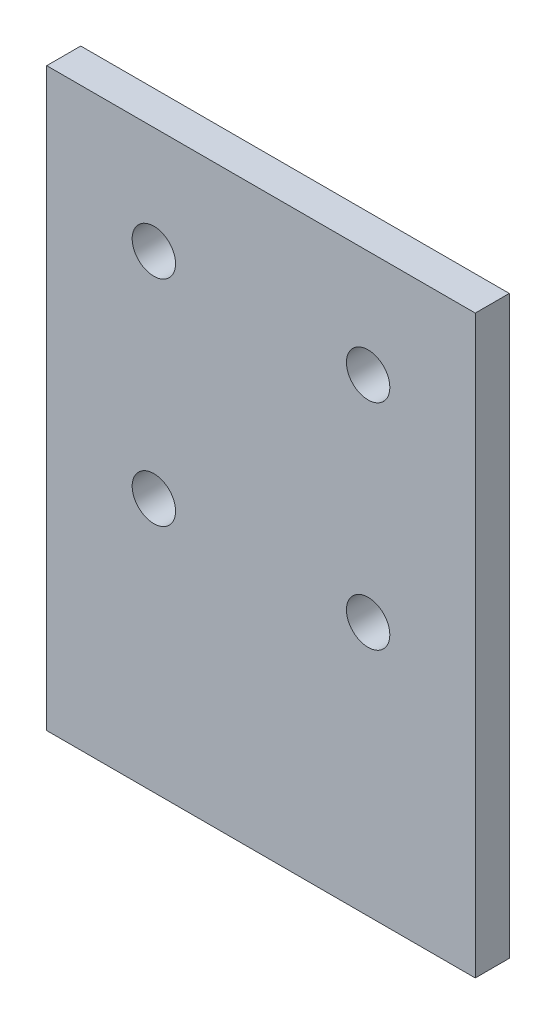
ISO-10303-21;
HEADER;
FILE_DESCRIPTION(('STEP AP214'),'2;1');
FILE_NAME('part.step','',(''),(''),'','','');
FILE_SCHEMA(('AUTOMOTIVE_DESIGN { 1 0 10303 214 1 1 1 1 }'));
ENDSEC;
DATA;
#1=APPLICATION_CONTEXT('core data for automotive mechanical design processes');
#2=APPLICATION_PROTOCOL_DEFINITION('international standard','automotive_design',2000,#1);
#3=PRODUCT_CONTEXT('',#1,'mechanical');
#4=PRODUCT('Part','Part','',(#3));
#5=PRODUCT_RELATED_PRODUCT_CATEGORY('part','',(#4));
#6=PRODUCT_DEFINITION_FORMATION('','',#4);
#7=PRODUCT_DEFINITION_CONTEXT('part definition',#1,'design');
#8=PRODUCT_DEFINITION('design','',#6,#7);
#9=PRODUCT_DEFINITION_SHAPE('','',#8);
#10=(LENGTH_UNIT() NAMED_UNIT(*) SI_UNIT(.MILLI.,.METRE.));
#11=(NAMED_UNIT(*) PLANE_ANGLE_UNIT() SI_UNIT($,.RADIAN.));
#12=(NAMED_UNIT(*) SI_UNIT($,.STERADIAN.) SOLID_ANGLE_UNIT());
#13=UNCERTAINTY_MEASURE_WITH_UNIT(LENGTH_MEASURE(1.E-05),#10,'distance_accuracy_value','');
#14=(GEOMETRIC_REPRESENTATION_CONTEXT(3) GLOBAL_UNCERTAINTY_ASSIGNED_CONTEXT((#13)) GLOBAL_UNIT_ASSIGNED_CONTEXT((#10,
#11,#12)) REPRESENTATION_CONTEXT('',''));
#15=CARTESIAN_POINT('',(0.,0.,0.));
#16=DIRECTION('',(0.,0.,1.));
#17=DIRECTION('',(1.,0.,0.));
#18=AXIS2_PLACEMENT_3D('',#15,#16,#17);
#19=CARTESIAN_POINT('',(0.,0.,6.35));
#20=DIRECTION('',(0.,0.,1.));
#21=DIRECTION('',(1.,0.,0.));
#22=AXIS2_PLACEMENT_3D('',#19,#20,#21);
#23=PLANE('',#22);
#24=CARTESIAN_POINT('',(20.,-20.,6.35));
#25=DIRECTION('',(0.,0.,1.));
#26=DIRECTION('',(1.,0.,0.));
#27=AXIS2_PLACEMENT_3D('',#24,#25,#26);
#28=CIRCLE('',#27,4.05);
#29=CARTESIAN_POINT('',(24.05,-20.,6.35));
#30=VERTEX_POINT('',#29);
#31=EDGE_CURVE('E122',#30,#30,#28,.T.);
#32=ORIENTED_EDGE('',*,*,#31,.F.);
#33=EDGE_LOOP('',(#32));
#34=FACE_BOUND('',#33,.T.);
#35=CARTESIAN_POINT('',(-20.,20.,6.35));
#36=DIRECTION('',(0.,0.,1.));
#37=DIRECTION('',(1.,0.,0.));
#38=AXIS2_PLACEMENT_3D('',#35,#36,#37);
#39=CIRCLE('',#38,4.05);
#40=CARTESIAN_POINT('',(-15.95,20.,6.35));
#41=VERTEX_POINT('',#40);
#42=EDGE_CURVE('E101',#41,#41,#39,.T.);
#43=ORIENTED_EDGE('',*,*,#42,.F.);
#44=EDGE_LOOP('',(#43));
#45=FACE_BOUND('',#44,.T.);
#46=DIRECTION('',(0.,-1.,0.));
#47=VECTOR('',#46,1.);
#48=CARTESIAN_POINT('',(-40.,40.,6.35));
#49=LINE('',#48,#47);
#50=CARTESIAN_POINT('',(-40.,40.,6.35));
#51=VERTEX_POINT('',#50);
#52=CARTESIAN_POINT('',(-40.,-67.5,6.35));
#53=VERTEX_POINT('',#52);
#54=EDGE_CURVE('E86',#51,#53,#49,.T.);
#55=ORIENTED_EDGE('',*,*,#54,.T.);
#56=DIRECTION('',(1.,0.,0.));
#57=VECTOR('',#56,1.);
#58=CARTESIAN_POINT('',(-40.,-67.5,6.35));
#59=LINE('',#58,#57);
#60=CARTESIAN_POINT('',(40.,-67.5,6.35));
#61=VERTEX_POINT('',#60);
#62=EDGE_CURVE('E81',#53,#61,#59,.T.);
#63=ORIENTED_EDGE('',*,*,#62,.T.);
#64=DIRECTION('',(0.,1.,0.));
#65=VECTOR('',#64,1.);
#66=CARTESIAN_POINT('',(40.,40.,6.35));
#67=LINE('',#66,#65);
#68=CARTESIAN_POINT('',(40.,40.,6.35));
#69=VERTEX_POINT('',#68);
#70=EDGE_CURVE('E84',#61,#69,#67,.T.);
#71=ORIENTED_EDGE('',*,*,#70,.T.);
#72=DIRECTION('',(-1.,0.,0.));
#73=VECTOR('',#72,1.);
#74=CARTESIAN_POINT('',(-40.,40.,6.35));
#75=LINE('',#74,#73);
#76=EDGE_CURVE('E51',#69,#51,#75,.T.);
#77=ORIENTED_EDGE('',*,*,#76,.T.);
#78=EDGE_LOOP('',(#55,#63,#71,#77));
#79=FACE_BOUND('',#78,.T.);
#80=CARTESIAN_POINT('',(20.,20.,6.35));
#81=DIRECTION('',(0.,0.,1.));
#82=DIRECTION('',(1.,0.,0.));
#83=AXIS2_PLACEMENT_3D('',#80,#81,#82);
#84=CIRCLE('',#83,4.05);
#85=CARTESIAN_POINT('',(24.05,20.,6.35));
#86=VERTEX_POINT('',#85);
#87=EDGE_CURVE('E116',#86,#86,#84,.T.);
#88=ORIENTED_EDGE('',*,*,#87,.F.);
#89=EDGE_LOOP('',(#88));
#90=FACE_BOUND('',#89,.T.);
#91=CARTESIAN_POINT('',(-20.,-20.,6.35));
#92=DIRECTION('',(0.,0.,1.));
#93=DIRECTION('',(1.,0.,0.));
#94=AXIS2_PLACEMENT_3D('',#91,#92,#93);
#95=CIRCLE('',#94,4.05);
#96=CARTESIAN_POINT('',(-15.95,-20.,6.35));
#97=VERTEX_POINT('',#96);
#98=EDGE_CURVE('E128',#97,#97,#95,.T.);
#99=ORIENTED_EDGE('',*,*,#98,.F.);
#100=EDGE_LOOP('',(#99));
#101=FACE_BOUND('',#100,.T.);
#102=ADVANCED_FACE('F34',(#34,#45,#79,#90,#101),#23,.T.);
#103=CARTESIAN_POINT('',(0.,0.,0.));
#104=DIRECTION('',(0.,0.,1.));
#105=DIRECTION('',(1.,0.,0.));
#106=AXIS2_PLACEMENT_3D('',#103,#104,#105);
#107=PLANE('',#106);
#108=DIRECTION('',(0.,-1.,0.));
#109=VECTOR('',#108,1.);
#110=CARTESIAN_POINT('',(-40.,40.,0.));
#111=LINE('',#110,#109);
#112=CARTESIAN_POINT('',(-40.,40.,0.));
#113=VERTEX_POINT('',#112);
#114=CARTESIAN_POINT('',(-40.,-67.5,0.));
#115=VERTEX_POINT('',#114);
#116=EDGE_CURVE('E98',#113,#115,#111,.T.);
#117=ORIENTED_EDGE('',*,*,#116,.F.);
#118=DIRECTION('',(-1.,0.,0.));
#119=VECTOR('',#118,1.);
#120=CARTESIAN_POINT('',(-40.,40.,0.));
#121=LINE('',#120,#119);
#122=CARTESIAN_POINT('',(40.,40.,0.));
#123=VERTEX_POINT('',#122);
#124=EDGE_CURVE('E74',#123,#113,#121,.T.);
#125=ORIENTED_EDGE('',*,*,#124,.F.);
#126=DIRECTION('',(0.,1.,0.));
#127=VECTOR('',#126,1.);
#128=CARTESIAN_POINT('',(40.,40.,0.));
#129=LINE('',#128,#127);
#130=CARTESIAN_POINT('',(40.,-67.5,0.));
#131=VERTEX_POINT('',#130);
#132=EDGE_CURVE('E68',#131,#123,#129,.T.);
#133=ORIENTED_EDGE('',*,*,#132,.F.);
#134=DIRECTION('',(1.,0.,0.));
#135=VECTOR('',#134,1.);
#136=CARTESIAN_POINT('',(-40.,-67.5,0.));
#137=LINE('',#136,#135);
#138=EDGE_CURVE('E90',#115,#131,#137,.T.);
#139=ORIENTED_EDGE('',*,*,#138,.F.);
#140=EDGE_LOOP('',(#117,#125,#133,#139));
#141=FACE_BOUND('',#140,.T.);
#142=CARTESIAN_POINT('',(-20.,20.,0.));
#143=DIRECTION('',(0.,0.,1.));
#144=DIRECTION('',(1.,0.,0.));
#145=AXIS2_PLACEMENT_3D('',#142,#143,#144);
#146=CIRCLE('',#145,4.05);
#147=CARTESIAN_POINT('',(-15.95,20.,0.));
#148=VERTEX_POINT('',#147);
#149=EDGE_CURVE('E113',#148,#148,#146,.T.);
#150=ORIENTED_EDGE('',*,*,#149,.T.);
#151=EDGE_LOOP('',(#150));
#152=FACE_BOUND('',#151,.T.);
#153=CARTESIAN_POINT('',(20.,20.,0.));
#154=DIRECTION('',(0.,0.,1.));
#155=DIRECTION('',(1.,0.,0.));
#156=AXIS2_PLACEMENT_3D('',#153,#154,#155);
#157=CIRCLE('',#156,4.05);
#158=CARTESIAN_POINT('',(24.05,20.,0.));
#159=VERTEX_POINT('',#158);
#160=EDGE_CURVE('E119',#159,#159,#157,.T.);
#161=ORIENTED_EDGE('',*,*,#160,.T.);
#162=EDGE_LOOP('',(#161));
#163=FACE_BOUND('',#162,.T.);
#164=CARTESIAN_POINT('',(20.,-20.,0.));
#165=DIRECTION('',(0.,0.,1.));
#166=DIRECTION('',(1.,0.,0.));
#167=AXIS2_PLACEMENT_3D('',#164,#165,#166);
#168=CIRCLE('',#167,4.05);
#169=CARTESIAN_POINT('',(24.05,-20.,0.));
#170=VERTEX_POINT('',#169);
#171=EDGE_CURVE('E125',#170,#170,#168,.T.);
#172=ORIENTED_EDGE('',*,*,#171,.T.);
#173=EDGE_LOOP('',(#172));
#174=FACE_BOUND('',#173,.T.);
#175=CARTESIAN_POINT('',(-20.,-20.,0.));
#176=DIRECTION('',(0.,0.,1.));
#177=DIRECTION('',(1.,0.,0.));
#178=AXIS2_PLACEMENT_3D('',#175,#176,#177);
#179=CIRCLE('',#178,4.05);
#180=CARTESIAN_POINT('',(-15.95,-20.,0.));
#181=VERTEX_POINT('',#180);
#182=EDGE_CURVE('E131',#181,#181,#179,.T.);
#183=ORIENTED_EDGE('',*,*,#182,.T.);
#184=EDGE_LOOP('',(#183));
#185=FACE_BOUND('',#184,.T.);
#186=ADVANCED_FACE('F109',(#141,#152,#163,#174,#185),#107,.F.);
#187=CARTESIAN_POINT('',(-40.,40.,6.35));
#188=DIRECTION('',(1.,0.,0.));
#189=DIRECTION('',(0.,1.,0.));
#190=AXIS2_PLACEMENT_3D('',#187,#188,#189);
#191=PLANE('',#190);
#192=ORIENTED_EDGE('',*,*,#116,.T.);
#193=DIRECTION('',(0.,0.,-1.));
#194=VECTOR('',#193,1.);
#195=CARTESIAN_POINT('',(-40.,-67.5,6.35));
#196=LINE('',#195,#194);
#197=EDGE_CURVE('E11',#53,#115,#196,.T.);
#198=ORIENTED_EDGE('',*,*,#197,.F.);
#199=ORIENTED_EDGE('',*,*,#54,.F.);
#200=DIRECTION('',(0.,0.,-1.));
#201=VECTOR('',#200,1.);
#202=CARTESIAN_POINT('',(-40.,40.,6.35));
#203=LINE('',#202,#201);
#204=EDGE_CURVE('E94',#51,#113,#203,.T.);
#205=ORIENTED_EDGE('',*,*,#204,.T.);
#206=EDGE_LOOP('',(#192,#198,#199,#205));
#207=FACE_BOUND('',#206,.T.);
#208=ADVANCED_FACE('F36',(#207),#191,.F.);
#209=CARTESIAN_POINT('',(-40.,-67.5,6.35));
#210=DIRECTION('',(0.,1.,0.));
#211=DIRECTION('',(0.,0.,1.));
#212=AXIS2_PLACEMENT_3D('',#209,#210,#211);
#213=PLANE('',#212);
#214=ORIENTED_EDGE('',*,*,#138,.T.);
#215=DIRECTION('',(0.,0.,-1.));
#216=VECTOR('',#215,1.);
#217=CARTESIAN_POINT('',(40.,-67.5,6.35));
#218=LINE('',#217,#216);
#219=EDGE_CURVE('E43',#61,#131,#218,.T.);
#220=ORIENTED_EDGE('',*,*,#219,.F.);
#221=ORIENTED_EDGE('',*,*,#62,.F.);
#222=ORIENTED_EDGE('',*,*,#197,.T.);
#223=EDGE_LOOP('',(#214,#220,#221,#222));
#224=FACE_BOUND('',#223,.T.);
#225=ADVANCED_FACE('F89',(#224),#213,.F.);
#226=CARTESIAN_POINT('',(40.,40.,6.35));
#227=DIRECTION('',(-1.,0.,0.));
#228=DIRECTION('',(0.,-1.,0.));
#229=AXIS2_PLACEMENT_3D('',#226,#227,#228);
#230=PLANE('',#229);
#231=ORIENTED_EDGE('',*,*,#132,.T.);
#232=DIRECTION('',(0.,0.,-1.));
#233=VECTOR('',#232,1.);
#234=CARTESIAN_POINT('',(40.,40.,6.35));
#235=LINE('',#234,#233);
#236=EDGE_CURVE('E91',#69,#123,#235,.T.);
#237=ORIENTED_EDGE('',*,*,#236,.F.);
#238=ORIENTED_EDGE('',*,*,#70,.F.);
#239=ORIENTED_EDGE('',*,*,#219,.T.);
#240=EDGE_LOOP('',(#231,#237,#238,#239));
#241=FACE_BOUND('',#240,.T.);
#242=ADVANCED_FACE('F92',(#241),#230,.F.);
#243=CARTESIAN_POINT('',(-40.,40.,6.35));
#244=DIRECTION('',(0.,-1.,0.));
#245=DIRECTION('',(0.,0.,-1.));
#246=AXIS2_PLACEMENT_3D('',#243,#244,#245);
#247=PLANE('',#246);
#248=ORIENTED_EDGE('',*,*,#124,.T.);
#249=ORIENTED_EDGE('',*,*,#204,.F.);
#250=ORIENTED_EDGE('',*,*,#76,.F.);
#251=ORIENTED_EDGE('',*,*,#236,.T.);
#252=EDGE_LOOP('',(#248,#249,#250,#251));
#253=FACE_BOUND('',#252,.T.);
#254=ADVANCED_FACE('F106',(#253),#247,.F.);
#255=CARTESIAN_POINT('',(-20.,20.,6.35));
#256=DIRECTION('',(0.,0.,-1.));
#257=DIRECTION('',(-1.,0.,0.));
#258=AXIS2_PLACEMENT_3D('',#255,#256,#257);
#259=CYLINDRICAL_SURFACE('',#258,4.05);
#260=ORIENTED_EDGE('',*,*,#42,.T.);
#261=EDGE_LOOP('',(#260));
#262=FACE_BOUND('',#261,.T.);
#263=ORIENTED_EDGE('',*,*,#149,.F.);
#264=EDGE_LOOP('',(#263));
#265=FACE_BOUND('',#264,.T.);
#266=ADVANCED_FACE('F150',(#262,#265),#259,.F.);
#267=CARTESIAN_POINT('',(20.,20.,6.35));
#268=DIRECTION('',(0.,0.,-1.));
#269=DIRECTION('',(-1.,0.,0.));
#270=AXIS2_PLACEMENT_3D('',#267,#268,#269);
#271=CYLINDRICAL_SURFACE('',#270,4.05);
#272=ORIENTED_EDGE('',*,*,#87,.T.);
#273=EDGE_LOOP('',(#272));
#274=FACE_BOUND('',#273,.T.);
#275=ORIENTED_EDGE('',*,*,#160,.F.);
#276=EDGE_LOOP('',(#275));
#277=FACE_BOUND('',#276,.T.);
#278=ADVANCED_FACE('F196',(#274,#277),#271,.F.);
#279=CARTESIAN_POINT('',(20.,-20.,6.35));
#280=DIRECTION('',(0.,0.,-1.));
#281=DIRECTION('',(-1.,0.,0.));
#282=AXIS2_PLACEMENT_3D('',#279,#280,#281);
#283=CYLINDRICAL_SURFACE('',#282,4.05);
#284=ORIENTED_EDGE('',*,*,#31,.T.);
#285=EDGE_LOOP('',(#284));
#286=FACE_BOUND('',#285,.T.);
#287=ORIENTED_EDGE('',*,*,#171,.F.);
#288=EDGE_LOOP('',(#287));
#289=FACE_BOUND('',#288,.T.);
#290=ADVANCED_FACE('F204',(#286,#289),#283,.F.);
#291=CARTESIAN_POINT('',(-20.,-20.,6.35));
#292=DIRECTION('',(0.,0.,-1.));
#293=DIRECTION('',(-1.,0.,0.));
#294=AXIS2_PLACEMENT_3D('',#291,#292,#293);
#295=CYLINDRICAL_SURFACE('',#294,4.05);
#296=ORIENTED_EDGE('',*,*,#98,.T.);
#297=EDGE_LOOP('',(#296));
#298=FACE_BOUND('',#297,.T.);
#299=ORIENTED_EDGE('',*,*,#182,.F.);
#300=EDGE_LOOP('',(#299));
#301=FACE_BOUND('',#300,.T.);
#302=ADVANCED_FACE('F137',(#298,#301),#295,.F.);
#303=CLOSED_SHELL('',(#102,#186,#208,#225,#242,#254,#266,#278,#290,#302));
#304=MANIFOLD_SOLID_BREP('B2',#303);
#305=ADVANCED_BREP_SHAPE_REPRESENTATION('',(#18,#304),#14);
#306=SHAPE_DEFINITION_REPRESENTATION(#9,#305);
ENDSEC;
END-ISO-10303-21;
